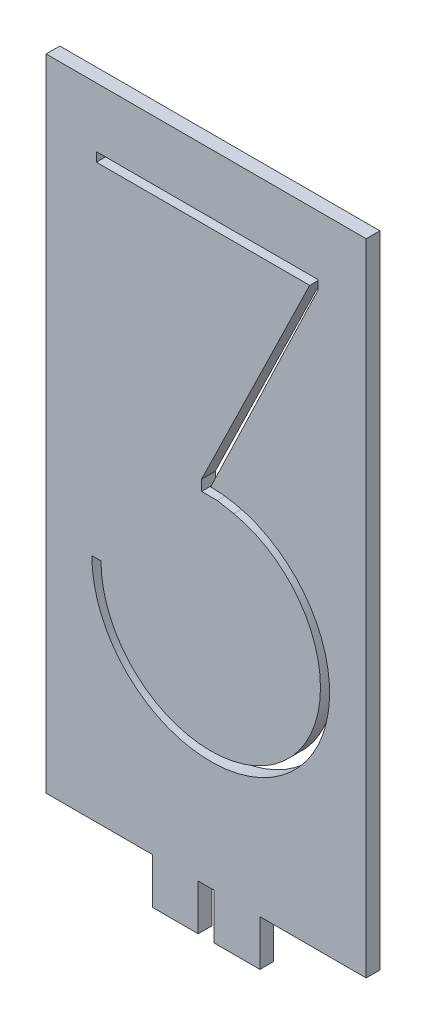
ISO-10303-21;
HEADER;
FILE_DESCRIPTION(('STEP AP214'),'2;1');
FILE_NAME('part.step','',(''),(''),'','','');
FILE_SCHEMA(('AUTOMOTIVE_DESIGN { 1 0 10303 214 1 1 1 1 }'));
ENDSEC;
DATA;
#1=APPLICATION_CONTEXT('core data for automotive mechanical design processes');
#2=APPLICATION_PROTOCOL_DEFINITION('international standard','automotive_design',2000,#1);
#3=PRODUCT_CONTEXT('',#1,'mechanical');
#4=PRODUCT('Part','Part','',(#3));
#5=PRODUCT_RELATED_PRODUCT_CATEGORY('part','',(#4));
#6=PRODUCT_DEFINITION_FORMATION('','',#4);
#7=PRODUCT_DEFINITION_CONTEXT('part definition',#1,'design');
#8=PRODUCT_DEFINITION('design','',#6,#7);
#9=PRODUCT_DEFINITION_SHAPE('','',#8);
#10=(LENGTH_UNIT() NAMED_UNIT(*) SI_UNIT(.MILLI.,.METRE.));
#11=(NAMED_UNIT(*) PLANE_ANGLE_UNIT() SI_UNIT($,.RADIAN.));
#12=(NAMED_UNIT(*) SI_UNIT($,.STERADIAN.) SOLID_ANGLE_UNIT());
#13=UNCERTAINTY_MEASURE_WITH_UNIT(LENGTH_MEASURE(1.E-05),#10,'distance_accuracy_value','');
#14=(GEOMETRIC_REPRESENTATION_CONTEXT(3) GLOBAL_UNCERTAINTY_ASSIGNED_CONTEXT((#13)) GLOBAL_UNIT_ASSIGNED_CONTEXT((#10,
#11,#12)) REPRESENTATION_CONTEXT('',''));
#15=CARTESIAN_POINT('',(0.,0.,0.));
#16=DIRECTION('',(0.,0.,1.));
#17=DIRECTION('',(1.,0.,0.));
#18=AXIS2_PLACEMENT_3D('',#15,#16,#17);
#19=CARTESIAN_POINT('',(0.,0.,1.5));
#20=DIRECTION('',(0.,1.,0.));
#21=DIRECTION('',(0.,0.,1.));
#22=AXIS2_PLACEMENT_3D('',#19,#20,#21);
#23=PLANE('',#22);
#24=DIRECTION('',(1.,0.,0.));
#25=VECTOR('',#24,1.);
#26=CARTESIAN_POINT('',(0.,0.,1.5));
#27=LINE('',#26,#25);
#28=CARTESIAN_POINT('',(11.63,0.,1.5));
#29=VERTEX_POINT('',#28);
#30=CARTESIAN_POINT('',(16.63,0.,1.5));
#31=VERTEX_POINT('',#30);
#32=EDGE_CURVE('E388',#29,#31,#27,.T.);
#33=ORIENTED_EDGE('',*,*,#32,.F.);
#34=DIRECTION('',(0.,0.,1.));
#35=VECTOR('',#34,1.);
#36=CARTESIAN_POINT('',(11.63,0.,0.));
#37=LINE('',#36,#35);
#38=CARTESIAN_POINT('',(11.63,0.,0.));
#39=VERTEX_POINT('',#38);
#40=EDGE_CURVE('E302',#39,#29,#37,.T.);
#41=ORIENTED_EDGE('',*,*,#40,.F.);
#42=DIRECTION('',(1.,0.,0.));
#43=VECTOR('',#42,1.);
#44=CARTESIAN_POINT('',(0.,0.,0.));
#45=LINE('',#44,#43);
#46=CARTESIAN_POINT('',(16.63,0.,0.));
#47=VERTEX_POINT('',#46);
#48=EDGE_CURVE('E403',#39,#47,#45,.T.);
#49=ORIENTED_EDGE('',*,*,#48,.T.);
#50=DIRECTION('',(0.,0.,1.));
#51=VECTOR('',#50,1.);
#52=CARTESIAN_POINT('',(16.63,0.,0.));
#53=LINE('',#52,#51);
#54=EDGE_CURVE('E358',#47,#31,#53,.T.);
#55=ORIENTED_EDGE('',*,*,#54,.T.);
#56=EDGE_LOOP('',(#33,#41,#49,#55));
#57=FACE_BOUND('',#56,.T.);
#58=ADVANCED_FACE('F39',(#57),#23,.F.);
#59=CARTESIAN_POINT('',(0.,0.,1.5));
#60=DIRECTION('',(1.,0.,0.));
#61=DIRECTION('',(0.,1.,0.));
#62=AXIS2_PLACEMENT_3D('',#59,#60,#61);
#63=PLANE('',#62);
#64=DIRECTION('',(0.,-1.,0.));
#65=VECTOR('',#64,1.);
#66=CARTESIAN_POINT('',(0.,0.,0.));
#67=LINE('',#66,#65);
#68=CARTESIAN_POINT('',(0.,75.,0.));
#69=VERTEX_POINT('',#68);
#70=CARTESIAN_POINT('',(0.,5.,0.));
#71=VERTEX_POINT('',#70);
#72=EDGE_CURVE('E314',#69,#71,#67,.T.);
#73=ORIENTED_EDGE('',*,*,#72,.T.);
#74=DIRECTION('',(0.,0.,1.));
#75=VECTOR('',#74,1.);
#76=CARTESIAN_POINT('',(0.,5.,0.));
#77=LINE('',#76,#75);
#78=CARTESIAN_POINT('',(0.,5.,1.5));
#79=VERTEX_POINT('',#78);
#80=EDGE_CURVE('E310',#71,#79,#77,.T.);
#81=ORIENTED_EDGE('',*,*,#80,.T.);
#82=DIRECTION('',(0.,-1.,0.));
#83=VECTOR('',#82,1.);
#84=CARTESIAN_POINT('',(0.,0.,1.5));
#85=LINE('',#84,#83);
#86=CARTESIAN_POINT('',(0.,75.,1.5));
#87=VERTEX_POINT('',#86);
#88=EDGE_CURVE('E379',#87,#79,#85,.T.);
#89=ORIENTED_EDGE('',*,*,#88,.F.);
#90=DIRECTION('',(0.,0.,-1.));
#91=VECTOR('',#90,1.);
#92=CARTESIAN_POINT('',(0.,75.,1.5));
#93=LINE('',#92,#91);
#94=EDGE_CURVE('E395',#87,#69,#93,.T.);
#95=ORIENTED_EDGE('',*,*,#94,.T.);
#96=EDGE_LOOP('',(#73,#81,#89,#95));
#97=FACE_BOUND('',#96,.T.);
#98=ADVANCED_FACE('F41',(#97),#63,.F.);
#99=CARTESIAN_POINT('',(18.38,0.,0.));
#100=VERTEX_POINT('',#99);
#101=CARTESIAN_POINT('',(23.38,0.,0.));
#102=VERTEX_POINT('',#101);
#103=EDGE_CURVE('E399',#100,#102,#45,.T.);
#104=ORIENTED_EDGE('',*,*,#103,.T.);
#105=DIRECTION('',(0.,0.,1.));
#106=VECTOR('',#105,1.);
#107=CARTESIAN_POINT('',(23.38,0.,0.));
#108=LINE('',#107,#106);
#109=CARTESIAN_POINT('',(23.38,0.,1.5));
#110=VERTEX_POINT('',#109);
#111=EDGE_CURVE('E329',#102,#110,#108,.T.);
#112=ORIENTED_EDGE('',*,*,#111,.T.);
#113=CARTESIAN_POINT('',(18.38,0.,1.5));
#114=VERTEX_POINT('',#113);
#115=EDGE_CURVE('E383',#114,#110,#27,.T.);
#116=ORIENTED_EDGE('',*,*,#115,.F.);
#117=DIRECTION('',(0.,0.,1.));
#118=VECTOR('',#117,1.);
#119=CARTESIAN_POINT('',(18.38,0.,0.));
#120=LINE('',#119,#118);
#121=EDGE_CURVE('E373',#100,#114,#120,.T.);
#122=ORIENTED_EDGE('',*,*,#121,.F.);
#123=EDGE_LOOP('',(#104,#112,#116,#122));
#124=FACE_BOUND('',#123,.T.);
#125=ADVANCED_FACE('F509',(#124),#23,.F.);
#126=CARTESIAN_POINT('',(35.,0.,1.5));
#127=DIRECTION('',(-1.,0.,0.));
#128=DIRECTION('',(0.,-1.,0.));
#129=AXIS2_PLACEMENT_3D('',#126,#127,#128);
#130=PLANE('',#129);
#131=DIRECTION('',(0.,1.,0.));
#132=VECTOR('',#131,1.);
#133=CARTESIAN_POINT('',(35.,0.,1.5));
#134=LINE('',#133,#132);
#135=CARTESIAN_POINT('',(35.,5.,1.5));
#136=VERTEX_POINT('',#135);
#137=CARTESIAN_POINT('',(35.,75.,1.5));
#138=VERTEX_POINT('',#137);
#139=EDGE_CURVE('E389',#136,#138,#134,.T.);
#140=ORIENTED_EDGE('',*,*,#139,.F.);
#141=DIRECTION('',(0.,0.,1.));
#142=VECTOR('',#141,1.);
#143=CARTESIAN_POINT('',(35.,5.,0.));
#144=LINE('',#143,#142);
#145=CARTESIAN_POINT('',(35.,5.,0.));
#146=VERTEX_POINT('',#145);
#147=EDGE_CURVE('E339',#146,#136,#144,.T.);
#148=ORIENTED_EDGE('',*,*,#147,.F.);
#149=DIRECTION('',(0.,1.,0.));
#150=VECTOR('',#149,1.);
#151=CARTESIAN_POINT('',(35.,0.,0.));
#152=LINE('',#151,#150);
#153=CARTESIAN_POINT('',(35.,75.,0.));
#154=VERTEX_POINT('',#153);
#155=EDGE_CURVE('E404',#146,#154,#152,.T.);
#156=ORIENTED_EDGE('',*,*,#155,.T.);
#157=DIRECTION('',(0.,0.,-1.));
#158=VECTOR('',#157,1.);
#159=CARTESIAN_POINT('',(35.,75.,1.5));
#160=LINE('',#159,#158);
#161=EDGE_CURVE('E412',#138,#154,#160,.T.);
#162=ORIENTED_EDGE('',*,*,#161,.F.);
#163=EDGE_LOOP('',(#140,#148,#156,#162));
#164=FACE_BOUND('',#163,.T.);
#165=ADVANCED_FACE('F517',(#164),#130,.F.);
#166=CARTESIAN_POINT('',(0.,75.,1.5));
#167=DIRECTION('',(0.,-1.,0.));
#168=DIRECTION('',(0.,0.,-1.));
#169=AXIS2_PLACEMENT_3D('',#166,#167,#168);
#170=PLANE('',#169);
#171=DIRECTION('',(-1.,0.,0.));
#172=VECTOR('',#171,1.);
#173=CARTESIAN_POINT('',(0.,75.,0.));
#174=LINE('',#173,#172);
#175=EDGE_CURVE('E384',#154,#69,#174,.T.);
#176=ORIENTED_EDGE('',*,*,#175,.T.);
#177=ORIENTED_EDGE('',*,*,#94,.F.);
#178=DIRECTION('',(-1.,0.,0.));
#179=VECTOR('',#178,1.);
#180=CARTESIAN_POINT('',(0.,75.,1.5));
#181=LINE('',#180,#179);
#182=EDGE_CURVE('E392',#138,#87,#181,.T.);
#183=ORIENTED_EDGE('',*,*,#182,.F.);
#184=ORIENTED_EDGE('',*,*,#161,.T.);
#185=EDGE_LOOP('',(#176,#177,#183,#184));
#186=FACE_BOUND('',#185,.T.);
#187=ADVANCED_FACE('F522',(#186),#170,.F.);
#188=CARTESIAN_POINT('',(0.,0.,1.5));
#189=DIRECTION('',(0.,0.,-1.));
#190=DIRECTION('',(-1.,0.,0.));
#191=AXIS2_PLACEMENT_3D('',#188,#189,#190);
#192=PLANE('',#191);
#193=DIRECTION('',(0.,-1.,0.));
#194=VECTOR('',#193,1.);
#195=CARTESIAN_POINT('',(5.49999999999997,68.4999999999998,1.5));
#196=LINE('',#195,#194);
#197=CARTESIAN_POINT('',(5.49999999999997,68.4999999999998,1.5));
#198=VERTEX_POINT('',#197);
#199=CARTESIAN_POINT('',(5.49999999999997,67.4999999999998,1.5));
#200=VERTEX_POINT('',#199);
#201=EDGE_CURVE('E213',#198,#200,#196,.T.);
#202=ORIENTED_EDGE('',*,*,#201,.F.);
#203=DIRECTION('',(-1.,0.,0.));
#204=VECTOR('',#203,1.);
#205=CARTESIAN_POINT('',(29.7349304191279,68.4999999999998,1.5));
#206=LINE('',#205,#204);
#207=CARTESIAN_POINT('',(29.7349304191279,68.4999999999998,1.5));
#208=VERTEX_POINT('',#207);
#209=EDGE_CURVE('E55',#208,#198,#206,.T.);
#210=ORIENTED_EDGE('',*,*,#209,.F.);
#211=DIRECTION('',(0.,1.,0.));
#212=VECTOR('',#211,1.);
#213=CARTESIAN_POINT('',(29.7349304191279,67.4999999999998,1.5));
#214=LINE('',#213,#212);
#215=CARTESIAN_POINT('',(29.7349304191279,67.4999999999998,1.5));
#216=VERTEX_POINT('',#215);
#217=EDGE_CURVE('E257',#216,#208,#214,.T.);
#218=ORIENTED_EDGE('',*,*,#217,.F.);
#219=DIRECTION('',(0.431980877254013,0.901882764935029,0.));
#220=VECTOR('',#219,1.);
#221=CARTESIAN_POINT('',(18.,43.,1.5));
#222=LINE('',#221,#220);
#223=CARTESIAN_POINT('',(18.,43.,1.5));
#224=VERTEX_POINT('',#223);
#225=EDGE_CURVE('E253',#224,#216,#222,.T.);
#226=ORIENTED_EDGE('',*,*,#225,.F.);
#227=CARTESIAN_POINT('',(18.,30.,1.5));
#228=DIRECTION('',(0.,0.,1.));
#229=DIRECTION('',(1.,0.,0.));
#230=AXIS2_PLACEMENT_3D('',#227,#228,#229);
#231=CIRCLE('',#230,13.);
#232=CARTESIAN_POINT('',(5.,30.,1.5));
#233=VERTEX_POINT('',#232);
#234=EDGE_CURVE('E249',#233,#224,#231,.T.);
#235=ORIENTED_EDGE('',*,*,#234,.F.);
#236=DIRECTION('',(-1.,0.,0.));
#237=VECTOR('',#236,1.);
#238=CARTESIAN_POINT('',(5.,30.,1.5));
#239=LINE('',#238,#237);
#240=CARTESIAN_POINT('',(6.,30.,1.5));
#241=VERTEX_POINT('',#240);
#242=EDGE_CURVE('E245',#241,#233,#239,.T.);
#243=ORIENTED_EDGE('',*,*,#242,.F.);
#244=CARTESIAN_POINT('',(18.,30.,1.5));
#245=DIRECTION('',(0.,0.,-1.));
#246=DIRECTION('',(-1.,0.,0.));
#247=AXIS2_PLACEMENT_3D('',#244,#245,#246);
#248=CIRCLE('',#247,12.);
#249=CARTESIAN_POINT('',(20.5280475503217,41.7306852137167,1.5));
#250=VERTEX_POINT('',#249);
#251=EDGE_CURVE('E241',#250,#241,#248,.T.);
#252=ORIENTED_EDGE('',*,*,#251,.F.);
#253=DIRECTION('',(0.982721091706064,-0.185092560401657,0.));
#254=VECTOR('',#253,1.);
#255=CARTESIAN_POINT('',(20.5280475503217,41.7306852137167,1.5));
#256=LINE('',#255,#254);
#257=CARTESIAN_POINT('',(18.7315970411096,42.0690412612171,1.5));
#258=VERTEX_POINT('',#257);
#259=EDGE_CURVE('E237',#258,#250,#256,.T.);
#260=ORIENTED_EDGE('',*,*,#259,.F.);
#261=DIRECTION('',(1.,0.,0.));
#262=VECTOR('',#261,1.);
#263=CARTESIAN_POINT('',(18.7315970411096,42.0690412612171,1.5));
#264=LINE('',#263,#262);
#265=CARTESIAN_POINT('',(17.,42.0690412612171,1.5));
#266=VERTEX_POINT('',#265);
#267=EDGE_CURVE('E233',#266,#258,#264,.T.);
#268=ORIENTED_EDGE('',*,*,#267,.F.);
#269=DIRECTION('',(0.,-1.,0.));
#270=VECTOR('',#269,1.);
#271=CARTESIAN_POINT('',(17.,42.0690412612171,1.5));
#272=LINE('',#271,#270);
#273=CARTESIAN_POINT('',(17.,43.2306852137167,1.5));
#274=VERTEX_POINT('',#273);
#275=EDGE_CURVE('E226',#274,#266,#272,.T.);
#276=ORIENTED_EDGE('',*,*,#275,.F.);
#277=DIRECTION('',(-0.438058834032668,-0.898946304250671,0.));
#278=VECTOR('',#277,1.);
#279=CARTESIAN_POINT('',(17.,43.2306852137167,1.5));
#280=LINE('',#279,#278);
#281=CARTESIAN_POINT('',(28.8264991888619,67.4999999999998,1.5));
#282=VERTEX_POINT('',#281);
#283=EDGE_CURVE('E222',#282,#274,#280,.T.);
#284=ORIENTED_EDGE('',*,*,#283,.F.);
#285=DIRECTION('',(1.,0.,0.));
#286=VECTOR('',#285,1.);
#287=CARTESIAN_POINT('',(28.8264991888619,67.4999999999998,1.5));
#288=LINE('',#287,#286);
#289=EDGE_CURVE('E203',#200,#282,#288,.T.);
#290=ORIENTED_EDGE('',*,*,#289,.F.);
#291=EDGE_LOOP('',(#202,#210,#218,#226,#235,#243,#252,#260,#268,#276,#284,#290));
#292=FACE_BOUND('',#291,.T.);
#293=ORIENTED_EDGE('',*,*,#88,.T.);
#294=DIRECTION('',(-1.,0.,0.));
#295=VECTOR('',#294,1.);
#296=CARTESIAN_POINT('',(0.,5.,1.5));
#297=LINE('',#296,#295);
#298=CARTESIAN_POINT('',(11.63,5.,1.5));
#299=VERTEX_POINT('',#298);
#300=EDGE_CURVE('E298',#299,#79,#297,.T.);
#301=ORIENTED_EDGE('',*,*,#300,.F.);
#302=DIRECTION('',(0.,1.,0.));
#303=VECTOR('',#302,1.);
#304=CARTESIAN_POINT('',(11.63,0.,1.5));
#305=LINE('',#304,#303);
#306=EDGE_CURVE('E303',#29,#299,#305,.T.);
#307=ORIENTED_EDGE('',*,*,#306,.F.);
#308=ORIENTED_EDGE('',*,*,#32,.T.);
#309=DIRECTION('',(0.,-1.,0.));
#310=VECTOR('',#309,1.);
#311=CARTESIAN_POINT('',(16.63,0.,1.5));
#312=LINE('',#311,#310);
#313=CARTESIAN_POINT('',(16.63,5.,1.5));
#314=VERTEX_POINT('',#313);
#315=EDGE_CURVE('E264',#314,#31,#312,.T.);
#316=ORIENTED_EDGE('',*,*,#315,.F.);
#317=DIRECTION('',(-1.,0.,0.));
#318=VECTOR('',#317,1.);
#319=CARTESIAN_POINT('',(16.63,5.,1.5));
#320=LINE('',#319,#318);
#321=CARTESIAN_POINT('',(18.38,5.,1.5));
#322=VERTEX_POINT('',#321);
#323=EDGE_CURVE('E350',#322,#314,#320,.T.);
#324=ORIENTED_EDGE('',*,*,#323,.F.);
#325=DIRECTION('',(0.,1.,0.));
#326=VECTOR('',#325,1.);
#327=CARTESIAN_POINT('',(18.38,0.,1.5));
#328=LINE('',#327,#326);
#329=EDGE_CURVE('E361',#114,#322,#328,.T.);
#330=ORIENTED_EDGE('',*,*,#329,.F.);
#331=ORIENTED_EDGE('',*,*,#115,.T.);
#332=DIRECTION('',(0.,-1.,0.));
#333=VECTOR('',#332,1.);
#334=CARTESIAN_POINT('',(23.38,5.,1.5));
#335=LINE('',#334,#333);
#336=CARTESIAN_POINT('',(23.38,5.,1.5));
#337=VERTEX_POINT('',#336);
#338=EDGE_CURVE('E330',#337,#110,#335,.T.);
#339=ORIENTED_EDGE('',*,*,#338,.F.);
#340=DIRECTION('',(-1.,0.,0.));
#341=VECTOR('',#340,1.);
#342=CARTESIAN_POINT('',(23.38,5.,1.5));
#343=LINE('',#342,#341);
#344=EDGE_CURVE('E325',#136,#337,#343,.T.);
#345=ORIENTED_EDGE('',*,*,#344,.F.);
#346=ORIENTED_EDGE('',*,*,#139,.T.);
#347=ORIENTED_EDGE('',*,*,#182,.T.);
#348=EDGE_LOOP('',(#293,#301,#307,#308,#316,#324,#330,#331,#339,#345,#346,#347));
#349=FACE_BOUND('',#348,.T.);
#350=ADVANCED_FACE('F218',(#292,#349),#192,.F.);
#351=CARTESIAN_POINT('',(0.,0.,0.));
#352=DIRECTION('',(0.,0.,-1.));
#353=DIRECTION('',(-1.,0.,0.));
#354=AXIS2_PLACEMENT_3D('',#351,#352,#353);
#355=PLANE('',#354);
#356=DIRECTION('',(1.,0.,0.));
#357=VECTOR('',#356,1.);
#358=CARTESIAN_POINT('',(0.,68.4999999999998,0.));
#359=LINE('',#358,#357);
#360=CARTESIAN_POINT('',(5.49999999999997,68.4999999999998,0.));
#361=VERTEX_POINT('',#360);
#362=CARTESIAN_POINT('',(29.7349304191279,68.4999999999998,0.));
#363=VERTEX_POINT('',#362);
#364=EDGE_CURVE('E11',#361,#363,#359,.T.);
#365=ORIENTED_EDGE('',*,*,#364,.F.);
#366=DIRECTION('',(0.,1.,0.));
#367=VECTOR('',#366,1.);
#368=CARTESIAN_POINT('',(5.49999999999991,0.,0.));
#369=LINE('',#368,#367);
#370=CARTESIAN_POINT('',(5.49999999999997,67.4999999999998,0.));
#371=VERTEX_POINT('',#370);
#372=EDGE_CURVE('E416',#371,#361,#369,.T.);
#373=ORIENTED_EDGE('',*,*,#372,.F.);
#374=DIRECTION('',(-1.,0.,0.));
#375=VECTOR('',#374,1.);
#376=CARTESIAN_POINT('',(0.,67.4999999999998,0.));
#377=LINE('',#376,#375);
#378=CARTESIAN_POINT('',(28.8264991888619,67.4999999999998,0.));
#379=VERTEX_POINT('',#378);
#380=EDGE_CURVE('E206',#379,#371,#377,.T.);
#381=ORIENTED_EDGE('',*,*,#380,.F.);
#382=DIRECTION('',(0.438058834032668,0.898946304250671,0.));
#383=VECTOR('',#382,1.);
#384=CARTESIAN_POINT('',(-3.28609496719881,1.60132248505282,0.));
#385=LINE('',#384,#383);
#386=CARTESIAN_POINT('',(17.,43.2306852137167,0.));
#387=VERTEX_POINT('',#386);
#388=EDGE_CURVE('E421',#387,#379,#385,.T.);
#389=ORIENTED_EDGE('',*,*,#388,.F.);
#390=DIRECTION('',(0.,1.,0.));
#391=VECTOR('',#390,1.);
#392=CARTESIAN_POINT('',(17.,0.,0.));
#393=LINE('',#392,#391);
#394=CARTESIAN_POINT('',(17.,42.0690412612171,0.));
#395=VERTEX_POINT('',#394);
#396=EDGE_CURVE('E424',#395,#387,#393,.T.);
#397=ORIENTED_EDGE('',*,*,#396,.F.);
#398=DIRECTION('',(-1.,0.,0.));
#399=VECTOR('',#398,1.);
#400=CARTESIAN_POINT('',(0.,42.0690412612171,0.));
#401=LINE('',#400,#399);
#402=CARTESIAN_POINT('',(18.7315970411096,42.0690412612171,0.));
#403=VERTEX_POINT('',#402);
#404=EDGE_CURVE('E427',#403,#395,#401,.T.);
#405=ORIENTED_EDGE('',*,*,#404,.F.);
#406=DIRECTION('',(-0.982721091706064,0.185092560401657,0.));
#407=VECTOR('',#406,1.);
#408=CARTESIAN_POINT('',(8.2938520400117,44.0349591227325,0.));
#409=LINE('',#408,#407);
#410=CARTESIAN_POINT('',(20.5280475503217,41.7306852137167,0.));
#411=VERTEX_POINT('',#410);
#412=EDGE_CURVE('E430',#411,#403,#409,.T.);
#413=ORIENTED_EDGE('',*,*,#412,.F.);
#414=CARTESIAN_POINT('',(18.,30.,0.));
#415=DIRECTION('',(0.,0.,-1.));
#416=DIRECTION('',(-1.,0.,0.));
#417=AXIS2_PLACEMENT_3D('',#414,#415,#416);
#418=CIRCLE('',#417,12.);
#419=CARTESIAN_POINT('',(6.,30.,0.));
#420=VERTEX_POINT('',#419);
#421=EDGE_CURVE('E433',#420,#411,#418,.F.);
#422=ORIENTED_EDGE('',*,*,#421,.F.);
#423=DIRECTION('',(1.,0.,0.));
#424=VECTOR('',#423,1.);
#425=CARTESIAN_POINT('',(0.,30.,0.));
#426=LINE('',#425,#424);
#427=CARTESIAN_POINT('',(5.,30.,0.));
#428=VERTEX_POINT('',#427);
#429=EDGE_CURVE('E436',#428,#420,#426,.T.);
#430=ORIENTED_EDGE('',*,*,#429,.F.);
#431=CARTESIAN_POINT('',(18.,30.,0.));
#432=DIRECTION('',(0.,0.,-1.));
#433=DIRECTION('',(-1.,0.,0.));
#434=AXIS2_PLACEMENT_3D('',#431,#432,#433);
#435=CIRCLE('',#434,13.);
#436=CARTESIAN_POINT('',(18.,43.,0.));
#437=VERTEX_POINT('',#436);
#438=EDGE_CURVE('E439',#437,#428,#435,.T.);
#439=ORIENTED_EDGE('',*,*,#438,.F.);
#440=DIRECTION('',(-0.431980877254013,-0.901882764935029,0.));
#441=VECTOR('',#440,1.);
#442=CARTESIAN_POINT('',(-2.11156725264371,1.01139162388095,0.));
#443=LINE('',#442,#441);
#444=CARTESIAN_POINT('',(29.7349304191279,67.4999999999998,0.));
#445=VERTEX_POINT('',#444);
#446=EDGE_CURVE('E442',#445,#437,#443,.T.);
#447=ORIENTED_EDGE('',*,*,#446,.F.);
#448=DIRECTION('',(0.,-1.,0.));
#449=VECTOR('',#448,1.);
#450=CARTESIAN_POINT('',(29.7349304191279,0.,0.));
#451=LINE('',#450,#449);
#452=EDGE_CURVE('E48',#363,#445,#451,.T.);
#453=ORIENTED_EDGE('',*,*,#452,.F.);
#454=EDGE_LOOP('',(#365,#373,#381,#389,#397,#405,#413,#422,#430,#439,#447,#453));
#455=FACE_BOUND('',#454,.T.);
#456=DIRECTION('',(-1.,0.,0.));
#457=VECTOR('',#456,1.);
#458=CARTESIAN_POINT('',(0.,5.,0.));
#459=LINE('',#458,#457);
#460=CARTESIAN_POINT('',(11.63,5.,0.));
#461=VERTEX_POINT('',#460);
#462=EDGE_CURVE('E297',#461,#71,#459,.T.);
#463=ORIENTED_EDGE('',*,*,#462,.T.);
#464=ORIENTED_EDGE('',*,*,#72,.F.);
#465=ORIENTED_EDGE('',*,*,#175,.F.);
#466=ORIENTED_EDGE('',*,*,#155,.F.);
#467=DIRECTION('',(-1.,0.,0.));
#468=VECTOR('',#467,1.);
#469=CARTESIAN_POINT('',(23.38,5.,0.));
#470=LINE('',#469,#468);
#471=CARTESIAN_POINT('',(23.38,5.,0.));
#472=VERTEX_POINT('',#471);
#473=EDGE_CURVE('E324',#146,#472,#470,.T.);
#474=ORIENTED_EDGE('',*,*,#473,.T.);
#475=DIRECTION('',(0.,-1.,0.));
#476=VECTOR('',#475,1.);
#477=CARTESIAN_POINT('',(23.38,5.,0.));
#478=LINE('',#477,#476);
#479=EDGE_CURVE('E320',#472,#102,#478,.T.);
#480=ORIENTED_EDGE('',*,*,#479,.T.);
#481=ORIENTED_EDGE('',*,*,#103,.F.);
#482=DIRECTION('',(0.,1.,0.));
#483=VECTOR('',#482,1.);
#484=CARTESIAN_POINT('',(18.38,0.,0.));
#485=LINE('',#484,#483);
#486=CARTESIAN_POINT('',(18.38,5.,0.));
#487=VERTEX_POINT('',#486);
#488=EDGE_CURVE('E349',#100,#487,#485,.T.);
#489=ORIENTED_EDGE('',*,*,#488,.T.);
#490=DIRECTION('',(-1.,0.,0.));
#491=VECTOR('',#490,1.);
#492=CARTESIAN_POINT('',(16.63,5.,0.));
#493=LINE('',#492,#491);
#494=CARTESIAN_POINT('',(16.63,5.,0.));
#495=VERTEX_POINT('',#494);
#496=EDGE_CURVE('E354',#487,#495,#493,.T.);
#497=ORIENTED_EDGE('',*,*,#496,.T.);
#498=DIRECTION('',(0.,-1.,0.));
#499=VECTOR('',#498,1.);
#500=CARTESIAN_POINT('',(16.63,0.,0.));
#501=LINE('',#500,#499);
#502=EDGE_CURVE('E345',#495,#47,#501,.T.);
#503=ORIENTED_EDGE('',*,*,#502,.T.);
#504=ORIENTED_EDGE('',*,*,#48,.F.);
#505=DIRECTION('',(0.,1.,0.));
#506=VECTOR('',#505,1.);
#507=CARTESIAN_POINT('',(11.63,0.,0.));
#508=LINE('',#507,#506);
#509=EDGE_CURVE('E293',#39,#461,#508,.T.);
#510=ORIENTED_EDGE('',*,*,#509,.T.);
#511=EDGE_LOOP('',(#463,#464,#465,#466,#474,#480,#481,#489,#497,#503,#504,#510));
#512=FACE_BOUND('',#511,.T.);
#513=ADVANCED_FACE('F459',(#455,#512),#355,.T.);
#514=CARTESIAN_POINT('',(16.63,0.,0.));
#515=DIRECTION('',(-1.,0.,0.));
#516=DIRECTION('',(0.,0.,1.));
#517=AXIS2_PLACEMENT_3D('',#514,#515,#516);
#518=PLANE('',#517);
#519=ORIENTED_EDGE('',*,*,#315,.T.);
#520=ORIENTED_EDGE('',*,*,#54,.F.);
#521=ORIENTED_EDGE('',*,*,#502,.F.);
#522=DIRECTION('',(0.,0.,1.));
#523=VECTOR('',#522,1.);
#524=CARTESIAN_POINT('',(16.63,5.,0.));
#525=LINE('',#524,#523);
#526=EDGE_CURVE('E333',#495,#314,#525,.T.);
#527=ORIENTED_EDGE('',*,*,#526,.T.);
#528=EDGE_LOOP('',(#519,#520,#521,#527));
#529=FACE_BOUND('',#528,.T.);
#530=ADVANCED_FACE('F572',(#529),#518,.F.);
#531=CARTESIAN_POINT('',(16.63,5.,0.));
#532=DIRECTION('',(0.,1.,0.));
#533=DIRECTION('',(0.,0.,1.));
#534=AXIS2_PLACEMENT_3D('',#531,#532,#533);
#535=PLANE('',#534);
#536=ORIENTED_EDGE('',*,*,#323,.T.);
#537=ORIENTED_EDGE('',*,*,#526,.F.);
#538=ORIENTED_EDGE('',*,*,#496,.F.);
#539=DIRECTION('',(0.,0.,1.));
#540=VECTOR('',#539,1.);
#541=CARTESIAN_POINT('',(18.38,5.,0.));
#542=LINE('',#541,#540);
#543=EDGE_CURVE('E370',#487,#322,#542,.T.);
#544=ORIENTED_EDGE('',*,*,#543,.T.);
#545=EDGE_LOOP('',(#536,#537,#538,#544));
#546=FACE_BOUND('',#545,.T.);
#547=ADVANCED_FACE('F544',(#546),#535,.F.);
#548=CARTESIAN_POINT('',(18.38,0.,0.));
#549=DIRECTION('',(1.,0.,0.));
#550=DIRECTION('',(0.,0.,-1.));
#551=AXIS2_PLACEMENT_3D('',#548,#549,#550);
#552=PLANE('',#551);
#553=ORIENTED_EDGE('',*,*,#329,.T.);
#554=ORIENTED_EDGE('',*,*,#543,.F.);
#555=ORIENTED_EDGE('',*,*,#488,.F.);
#556=ORIENTED_EDGE('',*,*,#121,.T.);
#557=EDGE_LOOP('',(#553,#554,#555,#556));
#558=FACE_BOUND('',#557,.T.);
#559=ADVANCED_FACE('F542',(#558),#552,.F.);
#560=CARTESIAN_POINT('',(23.38,5.,0.));
#561=DIRECTION('',(-1.,0.,0.));
#562=DIRECTION('',(0.,0.,1.));
#563=AXIS2_PLACEMENT_3D('',#560,#561,#562);
#564=PLANE('',#563);
#565=ORIENTED_EDGE('',*,*,#338,.T.);
#566=ORIENTED_EDGE('',*,*,#111,.F.);
#567=ORIENTED_EDGE('',*,*,#479,.F.);
#568=DIRECTION('',(0.,0.,1.));
#569=VECTOR('',#568,1.);
#570=CARTESIAN_POINT('',(23.38,5.,0.));
#571=LINE('',#570,#569);
#572=EDGE_CURVE('E307',#472,#337,#571,.T.);
#573=ORIENTED_EDGE('',*,*,#572,.T.);
#574=EDGE_LOOP('',(#565,#566,#567,#573));
#575=FACE_BOUND('',#574,.T.);
#576=ADVANCED_FACE('F530',(#575),#564,.F.);
#577=CARTESIAN_POINT('',(23.38,5.,0.));
#578=DIRECTION('',(0.,1.,0.));
#579=DIRECTION('',(0.,0.,1.));
#580=AXIS2_PLACEMENT_3D('',#577,#578,#579);
#581=PLANE('',#580);
#582=ORIENTED_EDGE('',*,*,#344,.T.);
#583=ORIENTED_EDGE('',*,*,#572,.F.);
#584=ORIENTED_EDGE('',*,*,#473,.F.);
#585=ORIENTED_EDGE('',*,*,#147,.T.);
#586=EDGE_LOOP('',(#582,#583,#584,#585));
#587=FACE_BOUND('',#586,.T.);
#588=ADVANCED_FACE('F532',(#587),#581,.F.);
#589=CARTESIAN_POINT('',(0.,5.,0.));
#590=DIRECTION('',(0.,1.,0.));
#591=DIRECTION('',(0.,0.,1.));
#592=AXIS2_PLACEMENT_3D('',#589,#590,#591);
#593=PLANE('',#592);
#594=ORIENTED_EDGE('',*,*,#300,.T.);
#595=ORIENTED_EDGE('',*,*,#80,.F.);
#596=ORIENTED_EDGE('',*,*,#462,.F.);
#597=DIRECTION('',(0.,0.,1.));
#598=VECTOR('',#597,1.);
#599=CARTESIAN_POINT('',(11.63,5.,0.));
#600=LINE('',#599,#598);
#601=EDGE_CURVE('E315',#461,#299,#600,.T.);
#602=ORIENTED_EDGE('',*,*,#601,.T.);
#603=EDGE_LOOP('',(#594,#595,#596,#602));
#604=FACE_BOUND('',#603,.T.);
#605=ADVANCED_FACE('F502',(#604),#593,.F.);
#606=CARTESIAN_POINT('',(11.63,0.,0.));
#607=DIRECTION('',(1.,0.,0.));
#608=DIRECTION('',(0.,1.,0.));
#609=AXIS2_PLACEMENT_3D('',#606,#607,#608);
#610=PLANE('',#609);
#611=ORIENTED_EDGE('',*,*,#306,.T.);
#612=ORIENTED_EDGE('',*,*,#601,.F.);
#613=ORIENTED_EDGE('',*,*,#509,.F.);
#614=ORIENTED_EDGE('',*,*,#40,.T.);
#615=EDGE_LOOP('',(#611,#612,#613,#614));
#616=FACE_BOUND('',#615,.T.);
#617=ADVANCED_FACE('F495',(#616),#610,.F.);
#618=CARTESIAN_POINT('',(29.7349304191279,68.4999999999998,-18.5));
#619=DIRECTION('',(0.,1.,0.));
#620=DIRECTION('',(0.,0.,1.));
#621=AXIS2_PLACEMENT_3D('',#618,#619,#620);
#622=PLANE('',#621);
#623=ORIENTED_EDGE('',*,*,#364,.T.);
#624=DIRECTION('',(0.,0.,1.));
#625=VECTOR('',#624,1.);
#626=CARTESIAN_POINT('',(29.7349304191279,68.4999999999998,-18.5));
#627=LINE('',#626,#625);
#628=EDGE_CURVE('E261',#363,#208,#627,.T.);
#629=ORIENTED_EDGE('',*,*,#628,.T.);
#630=ORIENTED_EDGE('',*,*,#209,.T.);
#631=DIRECTION('',(0.,0.,1.));
#632=VECTOR('',#631,1.);
#633=CARTESIAN_POINT('',(5.49999999999997,68.4999999999998,-18.5));
#634=LINE('',#633,#632);
#635=EDGE_CURVE('E210',#361,#198,#634,.T.);
#636=ORIENTED_EDGE('',*,*,#635,.F.);
#637=EDGE_LOOP('',(#623,#629,#630,#636));
#638=FACE_BOUND('',#637,.T.);
#639=ADVANCED_FACE('F493',(#638),#622,.F.);
#640=CARTESIAN_POINT('',(29.7349304191279,67.4999999999998,-18.5));
#641=DIRECTION('',(1.,0.,0.));
#642=DIRECTION('',(0.,0.,-1.));
#643=AXIS2_PLACEMENT_3D('',#640,#641,#642);
#644=PLANE('',#643);
#645=ORIENTED_EDGE('',*,*,#452,.T.);
#646=DIRECTION('',(0.,0.,1.));
#647=VECTOR('',#646,1.);
#648=CARTESIAN_POINT('',(29.7349304191279,67.4999999999998,-18.5));
#649=LINE('',#648,#647);
#650=EDGE_CURVE('E265',#445,#216,#649,.T.);
#651=ORIENTED_EDGE('',*,*,#650,.T.);
#652=ORIENTED_EDGE('',*,*,#217,.T.);
#653=ORIENTED_EDGE('',*,*,#628,.F.);
#654=EDGE_LOOP('',(#645,#651,#652,#653));
#655=FACE_BOUND('',#654,.T.);
#656=ADVANCED_FACE('F449',(#655),#644,.F.);
#657=CARTESIAN_POINT('',(18.,43.,-18.5));
#658=DIRECTION('',(0.901882764935029,-0.431980877254013,0.));
#659=DIRECTION('',(0.431980877254013,0.901882764935029,0.));
#660=AXIS2_PLACEMENT_3D('',#657,#658,#659);
#661=PLANE('',#660);
#662=ORIENTED_EDGE('',*,*,#446,.T.);
#663=DIRECTION('',(0.,0.,1.));
#664=VECTOR('',#663,1.);
#665=CARTESIAN_POINT('',(18.,43.,-18.5));
#666=LINE('',#665,#664);
#667=EDGE_CURVE('E268',#437,#224,#666,.T.);
#668=ORIENTED_EDGE('',*,*,#667,.T.);
#669=ORIENTED_EDGE('',*,*,#225,.T.);
#670=ORIENTED_EDGE('',*,*,#650,.F.);
#671=EDGE_LOOP('',(#662,#668,#669,#670));
#672=FACE_BOUND('',#671,.T.);
#673=ADVANCED_FACE('F454',(#672),#661,.F.);
#674=CARTESIAN_POINT('',(18.,30.,-18.5));
#675=DIRECTION('',(0.,0.,1.));
#676=DIRECTION('',(1.,0.,0.));
#677=AXIS2_PLACEMENT_3D('',#674,#675,#676);
#678=CYLINDRICAL_SURFACE('',#677,13.);
#679=ORIENTED_EDGE('',*,*,#438,.T.);
#680=DIRECTION('',(0.,0.,1.));
#681=VECTOR('',#680,1.);
#682=CARTESIAN_POINT('',(5.,30.,-18.5));
#683=LINE('',#682,#681);
#684=EDGE_CURVE('E271',#428,#233,#683,.T.);
#685=ORIENTED_EDGE('',*,*,#684,.T.);
#686=ORIENTED_EDGE('',*,*,#234,.T.);
#687=ORIENTED_EDGE('',*,*,#667,.F.);
#688=EDGE_LOOP('',(#679,#685,#686,#687));
#689=FACE_BOUND('',#688,.T.);
#690=ADVANCED_FACE('F465',(#689),#678,.F.);
#691=CARTESIAN_POINT('',(5.,30.,-18.5));
#692=DIRECTION('',(0.,1.,0.));
#693=DIRECTION('',(0.,0.,1.));
#694=AXIS2_PLACEMENT_3D('',#691,#692,#693);
#695=PLANE('',#694);
#696=ORIENTED_EDGE('',*,*,#429,.T.);
#697=DIRECTION('',(0.,0.,1.));
#698=VECTOR('',#697,1.);
#699=CARTESIAN_POINT('',(6.,30.,-18.5));
#700=LINE('',#699,#698);
#701=EDGE_CURVE('E274',#420,#241,#700,.T.);
#702=ORIENTED_EDGE('',*,*,#701,.T.);
#703=ORIENTED_EDGE('',*,*,#242,.T.);
#704=ORIENTED_EDGE('',*,*,#684,.F.);
#705=EDGE_LOOP('',(#696,#702,#703,#704));
#706=FACE_BOUND('',#705,.T.);
#707=ADVANCED_FACE('F467',(#706),#695,.F.);
#708=CARTESIAN_POINT('',(18.,30.,-18.5));
#709=DIRECTION('',(0.,0.,1.));
#710=DIRECTION('',(1.,0.,0.));
#711=AXIS2_PLACEMENT_3D('',#708,#709,#710);
#712=CYLINDRICAL_SURFACE('',#711,12.);
#713=ORIENTED_EDGE('',*,*,#421,.T.);
#714=DIRECTION('',(0.,0.,1.));
#715=VECTOR('',#714,1.);
#716=CARTESIAN_POINT('',(20.5280475503217,41.7306852137167,-18.5));
#717=LINE('',#716,#715);
#718=EDGE_CURVE('E277',#411,#250,#717,.T.);
#719=ORIENTED_EDGE('',*,*,#718,.T.);
#720=ORIENTED_EDGE('',*,*,#251,.T.);
#721=ORIENTED_EDGE('',*,*,#701,.F.);
#722=EDGE_LOOP('',(#713,#719,#720,#721));
#723=FACE_BOUND('',#722,.T.);
#724=ADVANCED_FACE('F476',(#723),#712,.T.);
#725=CARTESIAN_POINT('',(20.5280475503217,41.7306852137167,-18.5));
#726=DIRECTION('',(-0.185092560401657,-0.982721091706064,0.));
#727=DIRECTION('',(0.982721091706064,-0.185092560401657,0.));
#728=AXIS2_PLACEMENT_3D('',#725,#726,#727);
#729=PLANE('',#728);
#730=ORIENTED_EDGE('',*,*,#412,.T.);
#731=DIRECTION('',(0.,0.,1.));
#732=VECTOR('',#731,1.);
#733=CARTESIAN_POINT('',(18.7315970411096,42.0690412612171,-18.5));
#734=LINE('',#733,#732);
#735=EDGE_CURVE('E280',#403,#258,#734,.T.);
#736=ORIENTED_EDGE('',*,*,#735,.T.);
#737=ORIENTED_EDGE('',*,*,#259,.T.);
#738=ORIENTED_EDGE('',*,*,#718,.F.);
#739=EDGE_LOOP('',(#730,#736,#737,#738));
#740=FACE_BOUND('',#739,.T.);
#741=ADVANCED_FACE('F480',(#740),#729,.F.);
#742=CARTESIAN_POINT('',(18.7315970411096,42.0690412612171,-18.5));
#743=DIRECTION('',(0.,-1.,0.));
#744=DIRECTION('',(0.,0.,-1.));
#745=AXIS2_PLACEMENT_3D('',#742,#743,#744);
#746=PLANE('',#745);
#747=ORIENTED_EDGE('',*,*,#404,.T.);
#748=DIRECTION('',(0.,0.,1.));
#749=VECTOR('',#748,1.);
#750=CARTESIAN_POINT('',(17.,42.0690412612171,-18.5));
#751=LINE('',#750,#749);
#752=EDGE_CURVE('E283',#395,#266,#751,.T.);
#753=ORIENTED_EDGE('',*,*,#752,.T.);
#754=ORIENTED_EDGE('',*,*,#267,.T.);
#755=ORIENTED_EDGE('',*,*,#735,.F.);
#756=EDGE_LOOP('',(#747,#753,#754,#755));
#757=FACE_BOUND('',#756,.T.);
#758=ADVANCED_FACE('F484',(#757),#746,.F.);
#759=CARTESIAN_POINT('',(17.,42.0690412612171,-18.5));
#760=DIRECTION('',(-1.,0.,0.));
#761=DIRECTION('',(0.,0.,1.));
#762=AXIS2_PLACEMENT_3D('',#759,#760,#761);
#763=PLANE('',#762);
#764=ORIENTED_EDGE('',*,*,#396,.T.);
#765=DIRECTION('',(0.,0.,1.));
#766=VECTOR('',#765,1.);
#767=CARTESIAN_POINT('',(17.,43.2306852137167,-18.5));
#768=LINE('',#767,#766);
#769=EDGE_CURVE('E286',#387,#274,#768,.T.);
#770=ORIENTED_EDGE('',*,*,#769,.T.);
#771=ORIENTED_EDGE('',*,*,#275,.T.);
#772=ORIENTED_EDGE('',*,*,#752,.F.);
#773=EDGE_LOOP('',(#764,#770,#771,#772));
#774=FACE_BOUND('',#773,.T.);
#775=ADVANCED_FACE('F487',(#774),#763,.F.);
#776=CARTESIAN_POINT('',(17.,43.2306852137167,-18.5));
#777=DIRECTION('',(-0.898946304250671,0.438058834032668,0.));
#778=DIRECTION('',(-0.438058834032668,-0.898946304250671,0.));
#779=AXIS2_PLACEMENT_3D('',#776,#777,#778);
#780=PLANE('',#779);
#781=ORIENTED_EDGE('',*,*,#388,.T.);
#782=DIRECTION('',(0.,0.,1.));
#783=VECTOR('',#782,1.);
#784=CARTESIAN_POINT('',(28.8264991888619,67.4999999999998,-18.5));
#785=LINE('',#784,#783);
#786=EDGE_CURVE('E209',#379,#282,#785,.T.);
#787=ORIENTED_EDGE('',*,*,#786,.T.);
#788=ORIENTED_EDGE('',*,*,#283,.T.);
#789=ORIENTED_EDGE('',*,*,#769,.F.);
#790=EDGE_LOOP('',(#781,#787,#788,#789));
#791=FACE_BOUND('',#790,.T.);
#792=ADVANCED_FACE('F492',(#791),#780,.F.);
#793=CARTESIAN_POINT('',(28.8264991888619,67.4999999999998,-18.5));
#794=DIRECTION('',(0.,-1.,0.));
#795=DIRECTION('',(1.,0.,0.));
#796=AXIS2_PLACEMENT_3D('',#793,#794,#795);
#797=PLANE('',#796);
#798=ORIENTED_EDGE('',*,*,#380,.T.);
#799=DIRECTION('',(0.,0.,1.));
#800=VECTOR('',#799,1.);
#801=CARTESIAN_POINT('',(5.49999999999997,67.4999999999998,-18.5));
#802=LINE('',#801,#800);
#803=EDGE_CURVE('E63',#371,#200,#802,.T.);
#804=ORIENTED_EDGE('',*,*,#803,.T.);
#805=ORIENTED_EDGE('',*,*,#289,.T.);
#806=ORIENTED_EDGE('',*,*,#786,.F.);
#807=EDGE_LOOP('',(#798,#804,#805,#806));
#808=FACE_BOUND('',#807,.T.);
#809=ADVANCED_FACE('F200',(#808),#797,.F.);
#810=CARTESIAN_POINT('',(5.49999999999997,68.4999999999998,-18.5));
#811=DIRECTION('',(-1.,0.,0.));
#812=DIRECTION('',(0.,-1.,0.));
#813=AXIS2_PLACEMENT_3D('',#810,#811,#812);
#814=PLANE('',#813);
#815=ORIENTED_EDGE('',*,*,#372,.T.);
#816=ORIENTED_EDGE('',*,*,#635,.T.);
#817=ORIENTED_EDGE('',*,*,#201,.T.);
#818=ORIENTED_EDGE('',*,*,#803,.F.);
#819=EDGE_LOOP('',(#815,#816,#817,#818));
#820=FACE_BOUND('',#819,.T.);
#821=ADVANCED_FACE('F214',(#820),#814,.F.);
#822=CLOSED_SHELL('',(#58,#98,#125,#165,#187,#350,#513,#530,#547,#559,#576,#588,#605,#617,#639,
#656,#673,#690,#707,#724,#741,#758,#775,#792,#809,#821));
#823=MANIFOLD_SOLID_BREP('B2',#822);
#824=ADVANCED_BREP_SHAPE_REPRESENTATION('',(#18,#823),#14);
#825=SHAPE_DEFINITION_REPRESENTATION(#9,#824);
ENDSEC;
END-ISO-10303-21;
